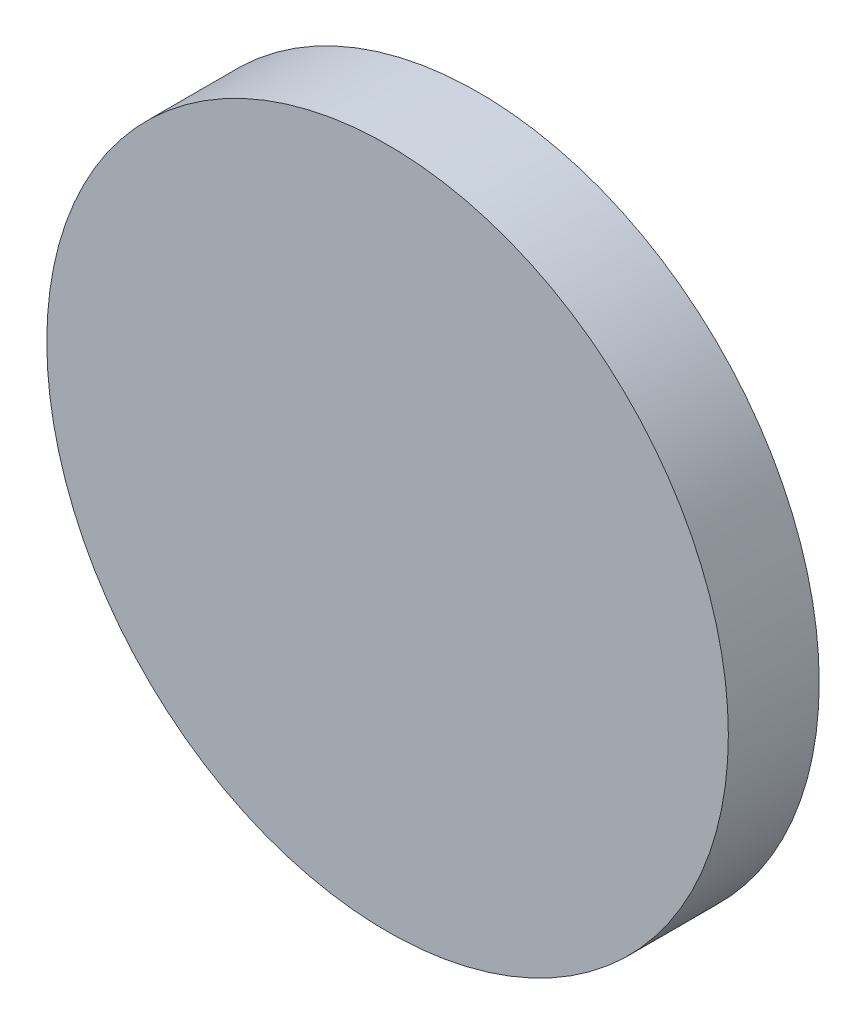
ISO-10303-21;
HEADER;
FILE_DESCRIPTION(('STEP AP214'),'2;1');
FILE_NAME('part.step','',(''),(''),'','','');
FILE_SCHEMA(('AUTOMOTIVE_DESIGN { 1 0 10303 214 1 1 1 1 }'));
ENDSEC;
DATA;
#1=APPLICATION_CONTEXT('core data for automotive mechanical design processes');
#2=APPLICATION_PROTOCOL_DEFINITION('international standard','automotive_design',2000,#1);
#3=PRODUCT_CONTEXT('',#1,'mechanical');
#4=PRODUCT('Part','Part','',(#3));
#5=PRODUCT_RELATED_PRODUCT_CATEGORY('part','',(#4));
#6=PRODUCT_DEFINITION_FORMATION('','',#4);
#7=PRODUCT_DEFINITION_CONTEXT('part definition',#1,'design');
#8=PRODUCT_DEFINITION('design','',#6,#7);
#9=PRODUCT_DEFINITION_SHAPE('','',#8);
#10=(LENGTH_UNIT() NAMED_UNIT(*) SI_UNIT(.MILLI.,.METRE.));
#11=(NAMED_UNIT(*) PLANE_ANGLE_UNIT() SI_UNIT($,.RADIAN.));
#12=(NAMED_UNIT(*) SI_UNIT($,.STERADIAN.) SOLID_ANGLE_UNIT());
#13=UNCERTAINTY_MEASURE_WITH_UNIT(LENGTH_MEASURE(1.E-05),#10,'distance_accuracy_value','');
#14=(GEOMETRIC_REPRESENTATION_CONTEXT(3) GLOBAL_UNCERTAINTY_ASSIGNED_CONTEXT((#13)) GLOBAL_UNIT_ASSIGNED_CONTEXT((#10,
#11,#12)) REPRESENTATION_CONTEXT('',''));
#15=CARTESIAN_POINT('',(0.,0.,0.));
#16=DIRECTION('',(0.,0.,1.));
#17=DIRECTION('',(1.,0.,0.));
#18=AXIS2_PLACEMENT_3D('',#15,#16,#17);
#19=CARTESIAN_POINT('',(0.,0.,20.));
#20=DIRECTION('',(0.,0.,-1.));
#21=DIRECTION('',(-1.,0.,0.));
#22=AXIS2_PLACEMENT_3D('',#19,#20,#21);
#23=CYLINDRICAL_SURFACE('',#22,75.);
#24=CARTESIAN_POINT('',(0.,0.,20.));
#25=DIRECTION('',(0.,0.,1.));
#26=DIRECTION('',(1.,0.,0.));
#27=AXIS2_PLACEMENT_3D('',#24,#25,#26);
#28=CIRCLE('',#27,75.);
#29=CARTESIAN_POINT('',(75.,0.,20.));
#30=VERTEX_POINT('',#29);
#31=EDGE_CURVE('E10',#30,#30,#28,.T.);
#32=ORIENTED_EDGE('',*,*,#31,.F.);
#33=EDGE_LOOP('',(#32));
#34=FACE_BOUND('',#33,.T.);
#35=CARTESIAN_POINT('',(0.,0.,0.));
#36=DIRECTION('',(0.,0.,1.));
#37=DIRECTION('',(1.,0.,0.));
#38=AXIS2_PLACEMENT_3D('',#35,#36,#37);
#39=CIRCLE('',#38,75.);
#40=CARTESIAN_POINT('',(75.,0.,0.));
#41=VERTEX_POINT('',#40);
#42=EDGE_CURVE('E44',#41,#41,#39,.T.);
#43=ORIENTED_EDGE('',*,*,#42,.T.);
#44=EDGE_LOOP('',(#43));
#45=FACE_BOUND('',#44,.T.);
#46=ADVANCED_FACE('F41',(#34,#45),#23,.T.);
#47=CARTESIAN_POINT('',(0.,0.,20.));
#48=DIRECTION('',(0.,0.,1.));
#49=DIRECTION('',(1.,0.,0.));
#50=AXIS2_PLACEMENT_3D('',#47,#48,#49);
#51=PLANE('',#50);
#52=ORIENTED_EDGE('',*,*,#31,.T.);
#53=EDGE_LOOP('',(#52));
#54=FACE_BOUND('',#53,.T.);
#55=ADVANCED_FACE('F58',(#54),#51,.T.);
#56=CARTESIAN_POINT('',(0.,0.,0.));
#57=DIRECTION('',(0.,0.,1.));
#58=DIRECTION('',(1.,0.,0.));
#59=AXIS2_PLACEMENT_3D('',#56,#57,#58);
#60=PLANE('',#59);
#61=ORIENTED_EDGE('',*,*,#42,.F.);
#62=EDGE_LOOP('',(#61));
#63=FACE_BOUND('',#62,.T.);
#64=ADVANCED_FACE('F56',(#63),#60,.F.);
#65=CLOSED_SHELL('',(#46,#55,#64));
#66=MANIFOLD_SOLID_BREP('B2',#65);
#67=ADVANCED_BREP_SHAPE_REPRESENTATION('',(#18,#66),#14);
#68=SHAPE_DEFINITION_REPRESENTATION(#9,#67);
ENDSEC;
END-ISO-10303-21;
